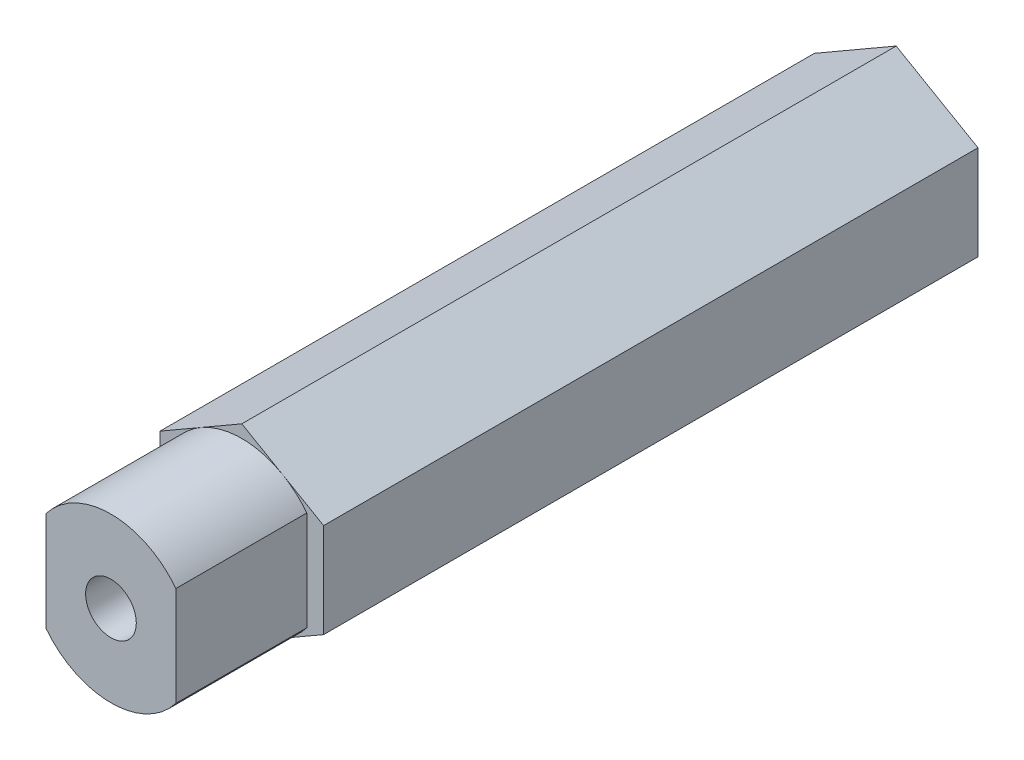
ISO-10303-21;
HEADER;
FILE_DESCRIPTION(('STEP AP214'),'2;1');
FILE_NAME('part.step','',(''),(''),'','','');
FILE_SCHEMA(('AUTOMOTIVE_DESIGN { 1 0 10303 214 1 1 1 1 }'));
ENDSEC;
DATA;
#1=APPLICATION_CONTEXT('core data for automotive mechanical design processes');
#2=APPLICATION_PROTOCOL_DEFINITION('international standard','automotive_design',2000,#1);
#3=PRODUCT_CONTEXT('',#1,'mechanical');
#4=PRODUCT('Part','Part','',(#3));
#5=PRODUCT_RELATED_PRODUCT_CATEGORY('part','',(#4));
#6=PRODUCT_DEFINITION_FORMATION('','',#4);
#7=PRODUCT_DEFINITION_CONTEXT('part definition',#1,'design');
#8=PRODUCT_DEFINITION('design','',#6,#7);
#9=PRODUCT_DEFINITION_SHAPE('','',#8);
#10=(LENGTH_UNIT() NAMED_UNIT(*) SI_UNIT(.MILLI.,.METRE.));
#11=(NAMED_UNIT(*) PLANE_ANGLE_UNIT() SI_UNIT($,.RADIAN.));
#12=(NAMED_UNIT(*) SI_UNIT($,.STERADIAN.) SOLID_ANGLE_UNIT());
#13=UNCERTAINTY_MEASURE_WITH_UNIT(LENGTH_MEASURE(1.E-05),#10,'distance_accuracy_value','');
#14=(GEOMETRIC_REPRESENTATION_CONTEXT(3) GLOBAL_UNCERTAINTY_ASSIGNED_CONTEXT((#13)) GLOBAL_UNIT_ASSIGNED_CONTEXT((#10,
#11,#12)) REPRESENTATION_CONTEXT('',''));
#15=CARTESIAN_POINT('',(0.,0.,0.));
#16=DIRECTION('',(0.,0.,1.));
#17=DIRECTION('',(1.,0.,0.));
#18=AXIS2_PLACEMENT_3D('',#15,#16,#17);
#19=CARTESIAN_POINT('',(0.,0.,24.));
#20=DIRECTION('',(0.,0.,-1.));
#21=DIRECTION('',(-1.,0.,0.));
#22=AXIS2_PLACEMENT_3D('',#19,#20,#21);
#23=PLANE('',#22);
#24=CARTESIAN_POINT('',(0.,0.,24.));
#25=DIRECTION('',(0.,0.,1.));
#26=DIRECTION('',(1.,0.,0.));
#27=AXIS2_PLACEMENT_3D('',#24,#25,#26);
#28=CIRCLE('',#27,1.55);
#29=CARTESIAN_POINT('',(1.55,0.,24.));
#30=VERTEX_POINT('',#29);
#31=EDGE_CURVE('E240',#30,#30,#28,.T.);
#32=ORIENTED_EDGE('',*,*,#31,.F.);
#33=EDGE_LOOP('',(#32));
#34=FACE_BOUND('',#33,.T.);
#35=CARTESIAN_POINT('',(0.,0.,24.));
#36=DIRECTION('',(0.,0.,1.));
#37=DIRECTION('',(1.,0.,0.));
#38=AXIS2_PLACEMENT_3D('',#35,#36,#37);
#39=CIRCLE('',#38,5.);
#40=CARTESIAN_POINT('',(-3.97,-3.03958878797774,24.));
#41=VERTEX_POINT('',#40);
#42=CARTESIAN_POINT('',(3.97,-3.03958878797774,24.));
#43=VERTEX_POINT('',#42);
#44=EDGE_CURVE('E54',#41,#43,#39,.T.);
#45=ORIENTED_EDGE('',*,*,#44,.T.);
#46=DIRECTION('',(0.,1.,0.));
#47=VECTOR('',#46,1.);
#48=CARTESIAN_POINT('',(3.97,0.,24.));
#49=LINE('',#48,#47);
#50=CARTESIAN_POINT('',(3.97,3.03958878797774,24.));
#51=VERTEX_POINT('',#50);
#52=EDGE_CURVE('E180',#43,#51,#49,.T.);
#53=ORIENTED_EDGE('',*,*,#52,.T.);
#54=CARTESIAN_POINT('',(0.,0.,24.));
#55=DIRECTION('',(0.,0.,1.));
#56=DIRECTION('',(1.,0.,0.));
#57=AXIS2_PLACEMENT_3D('',#54,#55,#56);
#58=CIRCLE('',#57,5.);
#59=CARTESIAN_POINT('',(-3.97,3.03958878797774,24.));
#60=VERTEX_POINT('',#59);
#61=EDGE_CURVE('E157',#60,#51,#58,.F.);
#62=ORIENTED_EDGE('',*,*,#61,.F.);
#63=DIRECTION('',(0.,1.,0.));
#64=VECTOR('',#63,1.);
#65=CARTESIAN_POINT('',(-3.97,0.,24.));
#66=LINE('',#65,#64);
#67=EDGE_CURVE('E170',#41,#60,#66,.T.);
#68=ORIENTED_EDGE('',*,*,#67,.F.);
#69=EDGE_LOOP('',(#45,#53,#62,#68));
#70=FACE_BOUND('',#69,.T.);
#71=ADVANCED_FACE('F39',(#34,#70),#23,.F.);
#72=CARTESIAN_POINT('',(0.,-5.77350269189626,24.));
#73=DIRECTION('',(0.5,0.866025403784439,0.));
#74=DIRECTION('',(-0.866025403784439,0.5,0.));
#75=AXIS2_PLACEMENT_3D('',#72,#73,#74);
#76=PLANE('',#75);
#77=DIRECTION('',(0.866025403784439,-0.5,0.));
#78=VECTOR('',#77,1.);
#79=CARTESIAN_POINT('',(-2.5,-4.33012701892219,16.));
#80=LINE('',#79,#78);
#81=CARTESIAN_POINT('',(-2.5,-4.33012701892219,16.));
#82=VERTEX_POINT('',#81);
#83=CARTESIAN_POINT('',(0.,-5.77350269189626,16.));
#84=VERTEX_POINT('',#83);
#85=EDGE_CURVE('E131',#82,#84,#80,.T.);
#86=ORIENTED_EDGE('',*,*,#85,.F.);
#87=DIRECTION('',(0.866025403784439,-0.5,0.));
#88=VECTOR('',#87,1.);
#89=CARTESIAN_POINT('',(-2.5,-4.33012701892219,16.));
#90=LINE('',#89,#88);
#91=CARTESIAN_POINT('',(-5.,-2.88675134594813,16.));
#92=VERTEX_POINT('',#91);
#93=EDGE_CURVE('E144',#92,#82,#90,.T.);
#94=ORIENTED_EDGE('',*,*,#93,.F.);
#95=DIRECTION('',(0.,0.,-1.));
#96=VECTOR('',#95,1.);
#97=CARTESIAN_POINT('',(-5.,-2.88675134594813,24.));
#98=LINE('',#97,#96);
#99=CARTESIAN_POINT('',(-5.,-2.88675134594813,-24.));
#100=VERTEX_POINT('',#99);
#101=EDGE_CURVE('E47',#92,#100,#98,.T.);
#102=ORIENTED_EDGE('',*,*,#101,.T.);
#103=DIRECTION('',(0.866025403784439,-0.5,0.));
#104=VECTOR('',#103,1.);
#105=CARTESIAN_POINT('',(0.,-5.77350269189626,-24.));
#106=LINE('',#105,#104);
#107=CARTESIAN_POINT('',(0.,-5.77350269189626,-24.));
#108=VERTEX_POINT('',#107);
#109=EDGE_CURVE('E203',#100,#108,#106,.T.);
#110=ORIENTED_EDGE('',*,*,#109,.T.);
#111=DIRECTION('',(0.,0.,-1.));
#112=VECTOR('',#111,1.);
#113=CARTESIAN_POINT('',(0.,-5.77350269189626,24.));
#114=LINE('',#113,#112);
#115=EDGE_CURVE('E147',#84,#108,#114,.T.);
#116=ORIENTED_EDGE('',*,*,#115,.F.);
#117=EDGE_LOOP('',(#86,#94,#102,#110,#116));
#118=FACE_BOUND('',#117,.T.);
#119=ADVANCED_FACE('F142',(#118),#76,.F.);
#120=CARTESIAN_POINT('',(5.,-2.88675134594813,24.));
#121=DIRECTION('',(-0.5,0.866025403784439,0.));
#122=DIRECTION('',(-0.866025403784439,-0.5,0.));
#123=AXIS2_PLACEMENT_3D('',#120,#121,#122);
#124=PLANE('',#123);
#125=DIRECTION('',(0.866025403784439,0.5,0.));
#126=VECTOR('',#125,1.);
#127=CARTESIAN_POINT('',(2.5,-4.33012701892219,16.));
#128=LINE('',#127,#126);
#129=CARTESIAN_POINT('',(2.5,-4.3301270189222,16.));
#130=VERTEX_POINT('',#129);
#131=EDGE_CURVE('E133',#84,#130,#128,.T.);
#132=ORIENTED_EDGE('',*,*,#131,.F.);
#133=ORIENTED_EDGE('',*,*,#115,.T.);
#134=DIRECTION('',(0.866025403784439,0.5,0.));
#135=VECTOR('',#134,1.);
#136=CARTESIAN_POINT('',(5.,-2.88675134594813,-24.));
#137=LINE('',#136,#135);
#138=CARTESIAN_POINT('',(5.,-2.88675134594813,-24.));
#139=VERTEX_POINT('',#138);
#140=EDGE_CURVE('E205',#108,#139,#137,.T.);
#141=ORIENTED_EDGE('',*,*,#140,.T.);
#142=DIRECTION('',(0.,0.,-1.));
#143=VECTOR('',#142,1.);
#144=CARTESIAN_POINT('',(5.,-2.88675134594813,24.));
#145=LINE('',#144,#143);
#146=CARTESIAN_POINT('',(5.,-2.88675134594813,16.));
#147=VERTEX_POINT('',#146);
#148=EDGE_CURVE('E216',#147,#139,#145,.T.);
#149=ORIENTED_EDGE('',*,*,#148,.F.);
#150=DIRECTION('',(0.866025403784439,0.5,0.));
#151=VECTOR('',#150,1.);
#152=CARTESIAN_POINT('',(2.5,-4.33012701892219,16.));
#153=LINE('',#152,#151);
#154=EDGE_CURVE('E179',#130,#147,#153,.T.);
#155=ORIENTED_EDGE('',*,*,#154,.F.);
#156=EDGE_LOOP('',(#132,#133,#141,#149,#155));
#157=FACE_BOUND('',#156,.T.);
#158=ADVANCED_FACE('F231',(#157),#124,.F.);
#159=CARTESIAN_POINT('',(-5.,2.88675134594813,24.));
#160=DIRECTION('',(0.5,-0.866025403784438,0.));
#161=DIRECTION('',(0.866025403784439,0.5,0.));
#162=AXIS2_PLACEMENT_3D('',#159,#160,#161);
#163=PLANE('',#162);
#164=DIRECTION('',(-0.866025403784439,-0.5,0.));
#165=VECTOR('',#164,1.);
#166=CARTESIAN_POINT('',(-2.5,4.33012701892219,16.));
#167=LINE('',#166,#165);
#168=CARTESIAN_POINT('',(0.,5.77350269189626,16.));
#169=VERTEX_POINT('',#168);
#170=CARTESIAN_POINT('',(-2.5,4.33012701892219,16.));
#171=VERTEX_POINT('',#170);
#172=EDGE_CURVE('E233',#169,#171,#167,.T.);
#173=ORIENTED_EDGE('',*,*,#172,.F.);
#174=DIRECTION('',(0.,0.,-1.));
#175=VECTOR('',#174,1.);
#176=CARTESIAN_POINT('',(0.,5.77350269189626,24.));
#177=LINE('',#176,#175);
#178=CARTESIAN_POINT('',(0.,5.77350269189626,-24.));
#179=VERTEX_POINT('',#178);
#180=EDGE_CURVE('E62',#169,#179,#177,.T.);
#181=ORIENTED_EDGE('',*,*,#180,.T.);
#182=DIRECTION('',(-0.866025403784439,-0.5,0.));
#183=VECTOR('',#182,1.);
#184=CARTESIAN_POINT('',(-5.,2.88675134594813,-24.));
#185=LINE('',#184,#183);
#186=CARTESIAN_POINT('',(-5.,2.88675134594813,-24.));
#187=VERTEX_POINT('',#186);
#188=EDGE_CURVE('E175',#179,#187,#185,.T.);
#189=ORIENTED_EDGE('',*,*,#188,.T.);
#190=DIRECTION('',(0.,0.,-1.));
#191=VECTOR('',#190,1.);
#192=CARTESIAN_POINT('',(-5.,2.88675134594813,24.));
#193=LINE('',#192,#191);
#194=CARTESIAN_POINT('',(-5.,2.88675134594813,16.));
#195=VERTEX_POINT('',#194);
#196=EDGE_CURVE('E11',#195,#187,#193,.T.);
#197=ORIENTED_EDGE('',*,*,#196,.F.);
#198=DIRECTION('',(-0.866025403784439,-0.5,0.));
#199=VECTOR('',#198,1.);
#200=CARTESIAN_POINT('',(-2.5,4.33012701892219,16.));
#201=LINE('',#200,#199);
#202=EDGE_CURVE('E165',#171,#195,#201,.T.);
#203=ORIENTED_EDGE('',*,*,#202,.F.);
#204=EDGE_LOOP('',(#173,#181,#189,#197,#203));
#205=FACE_BOUND('',#204,.T.);
#206=ADVANCED_FACE('F41',(#205),#163,.F.);
#207=CARTESIAN_POINT('',(0.,5.77350269189626,24.));
#208=DIRECTION('',(-0.5,-0.866025403784439,0.));
#209=DIRECTION('',(0.866025403784439,-0.5,0.));
#210=AXIS2_PLACEMENT_3D('',#207,#208,#209);
#211=PLANE('',#210);
#212=DIRECTION('',(-0.866025403784439,0.5,0.));
#213=VECTOR('',#212,1.);
#214=CARTESIAN_POINT('',(2.5,4.33012701892219,16.));
#215=LINE('',#214,#213);
#216=CARTESIAN_POINT('',(2.5,4.3301270189222,16.));
#217=VERTEX_POINT('',#216);
#218=EDGE_CURVE('E195',#217,#169,#215,.T.);
#219=ORIENTED_EDGE('',*,*,#218,.F.);
#220=DIRECTION('',(-0.866025403784439,0.5,0.));
#221=VECTOR('',#220,1.);
#222=CARTESIAN_POINT('',(2.5,4.33012701892219,16.));
#223=LINE('',#222,#221);
#224=CARTESIAN_POINT('',(5.,2.88675134594813,16.));
#225=VERTEX_POINT('',#224);
#226=EDGE_CURVE('E184',#225,#217,#223,.T.);
#227=ORIENTED_EDGE('',*,*,#226,.F.);
#228=DIRECTION('',(0.,0.,-1.));
#229=VECTOR('',#228,1.);
#230=CARTESIAN_POINT('',(5.,2.88675134594813,24.));
#231=LINE('',#230,#229);
#232=CARTESIAN_POINT('',(5.,2.88675134594813,-24.));
#233=VERTEX_POINT('',#232);
#234=EDGE_CURVE('E214',#225,#233,#231,.T.);
#235=ORIENTED_EDGE('',*,*,#234,.T.);
#236=DIRECTION('',(-0.866025403784439,0.5,0.));
#237=VECTOR('',#236,1.);
#238=CARTESIAN_POINT('',(0.,5.77350269189626,-24.));
#239=LINE('',#238,#237);
#240=EDGE_CURVE('E211',#233,#179,#239,.T.);
#241=ORIENTED_EDGE('',*,*,#240,.T.);
#242=ORIENTED_EDGE('',*,*,#180,.F.);
#243=EDGE_LOOP('',(#219,#227,#235,#241,#242));
#244=FACE_BOUND('',#243,.T.);
#245=ADVANCED_FACE('F252',(#244),#211,.F.);
#246=CARTESIAN_POINT('',(-5.,-2.88675134594813,24.));
#247=DIRECTION('',(1.,0.,0.));
#248=DIRECTION('',(0.,0.,-1.));
#249=AXIS2_PLACEMENT_3D('',#246,#247,#248);
#250=PLANE('',#249);
#251=DIRECTION('',(0.,-1.,0.));
#252=VECTOR('',#251,1.);
#253=CARTESIAN_POINT('',(-5.,0.,16.));
#254=LINE('',#253,#252);
#255=EDGE_CURVE('E161',#195,#92,#254,.T.);
#256=ORIENTED_EDGE('',*,*,#255,.F.);
#257=ORIENTED_EDGE('',*,*,#196,.T.);
#258=DIRECTION('',(0.,-1.,0.));
#259=VECTOR('',#258,1.);
#260=CARTESIAN_POINT('',(-5.,-2.88675134594813,-24.));
#261=LINE('',#260,#259);
#262=EDGE_CURVE('E200',#187,#100,#261,.T.);
#263=ORIENTED_EDGE('',*,*,#262,.T.);
#264=ORIENTED_EDGE('',*,*,#101,.F.);
#265=EDGE_LOOP('',(#256,#257,#263,#264));
#266=FACE_BOUND('',#265,.T.);
#267=ADVANCED_FACE('F222',(#266),#250,.F.);
#268=CARTESIAN_POINT('',(5.,2.88675134594813,24.));
#269=DIRECTION('',(-1.,0.,0.));
#270=DIRECTION('',(0.,-1.,0.));
#271=AXIS2_PLACEMENT_3D('',#268,#269,#270);
#272=PLANE('',#271);
#273=DIRECTION('',(0.,1.,0.));
#274=VECTOR('',#273,1.);
#275=CARTESIAN_POINT('',(5.,0.,16.));
#276=LINE('',#275,#274);
#277=EDGE_CURVE('E182',#147,#225,#276,.T.);
#278=ORIENTED_EDGE('',*,*,#277,.F.);
#279=ORIENTED_EDGE('',*,*,#148,.T.);
#280=DIRECTION('',(0.,1.,0.));
#281=VECTOR('',#280,1.);
#282=CARTESIAN_POINT('',(5.,2.88675134594813,-24.));
#283=LINE('',#282,#281);
#284=EDGE_CURVE('E208',#139,#233,#283,.T.);
#285=ORIENTED_EDGE('',*,*,#284,.T.);
#286=ORIENTED_EDGE('',*,*,#234,.F.);
#287=EDGE_LOOP('',(#278,#279,#285,#286));
#288=FACE_BOUND('',#287,.T.);
#289=ADVANCED_FACE('F257',(#288),#272,.F.);
#290=CARTESIAN_POINT('',(0.,0.,-24.));
#291=DIRECTION('',(0.,0.,-1.));
#292=DIRECTION('',(-1.,0.,0.));
#293=AXIS2_PLACEMENT_3D('',#290,#291,#292);
#294=PLANE('',#293);
#295=ORIENTED_EDGE('',*,*,#188,.F.);
#296=ORIENTED_EDGE('',*,*,#240,.F.);
#297=ORIENTED_EDGE('',*,*,#284,.F.);
#298=ORIENTED_EDGE('',*,*,#140,.F.);
#299=ORIENTED_EDGE('',*,*,#109,.F.);
#300=ORIENTED_EDGE('',*,*,#262,.F.);
#301=EDGE_LOOP('',(#295,#296,#297,#298,#299,#300));
#302=FACE_BOUND('',#301,.T.);
#303=ADVANCED_FACE('F226',(#302),#294,.T.);
#304=CARTESIAN_POINT('',(3.97,0.,16.));
#305=DIRECTION('',(1.,0.,0.));
#306=DIRECTION('',(0.,1.,0.));
#307=AXIS2_PLACEMENT_3D('',#304,#305,#306);
#308=PLANE('',#307);
#309=ORIENTED_EDGE('',*,*,#52,.F.);
#310=DIRECTION('',(0.,0.,1.));
#311=VECTOR('',#310,1.);
#312=CARTESIAN_POINT('',(3.97,-3.03958878797774,16.));
#313=LINE('',#312,#311);
#314=CARTESIAN_POINT('',(3.97,-3.03958878797774,16.));
#315=VERTEX_POINT('',#314);
#316=EDGE_CURVE('E171',#315,#43,#313,.T.);
#317=ORIENTED_EDGE('',*,*,#316,.F.);
#318=DIRECTION('',(0.,1.,0.));
#319=VECTOR('',#318,1.);
#320=CARTESIAN_POINT('',(3.97,0.,16.));
#321=LINE('',#320,#319);
#322=CARTESIAN_POINT('',(3.97,3.03958878797774,16.));
#323=VERTEX_POINT('',#322);
#324=EDGE_CURVE('E190',#315,#323,#321,.T.);
#325=ORIENTED_EDGE('',*,*,#324,.T.);
#326=DIRECTION('',(0.,0.,1.));
#327=VECTOR('',#326,1.);
#328=CARTESIAN_POINT('',(3.97,3.03958878797774,16.));
#329=LINE('',#328,#327);
#330=EDGE_CURVE('E192',#323,#51,#329,.T.);
#331=ORIENTED_EDGE('',*,*,#330,.T.);
#332=EDGE_LOOP('',(#309,#317,#325,#331));
#333=FACE_BOUND('',#332,.T.);
#334=ADVANCED_FACE('F263',(#333),#308,.T.);
#335=CARTESIAN_POINT('',(0.,0.,16.));
#336=DIRECTION('',(0.,0.,1.));
#337=DIRECTION('',(1.,0.,0.));
#338=AXIS2_PLACEMENT_3D('',#335,#336,#337);
#339=PLANE('',#338);
#340=CARTESIAN_POINT('',(0.,0.,16.));
#341=DIRECTION('',(0.,0.,1.));
#342=DIRECTION('',(1.,0.,0.));
#343=AXIS2_PLACEMENT_3D('',#340,#341,#342);
#344=CIRCLE('',#343,5.);
#345=EDGE_CURVE('E177',#130,#315,#344,.T.);
#346=ORIENTED_EDGE('',*,*,#345,.F.);
#347=ORIENTED_EDGE('',*,*,#154,.T.);
#348=ORIENTED_EDGE('',*,*,#277,.T.);
#349=ORIENTED_EDGE('',*,*,#226,.T.);
#350=CARTESIAN_POINT('',(0.,0.,16.));
#351=DIRECTION('',(0.,0.,1.));
#352=DIRECTION('',(1.,0.,0.));
#353=AXIS2_PLACEMENT_3D('',#350,#351,#352);
#354=CIRCLE('',#353,5.);
#355=EDGE_CURVE('E187',#217,#323,#354,.F.);
#356=ORIENTED_EDGE('',*,*,#355,.T.);
#357=ORIENTED_EDGE('',*,*,#324,.F.);
#358=EDGE_LOOP('',(#346,#347,#348,#349,#356,#357));
#359=FACE_BOUND('',#358,.T.);
#360=ADVANCED_FACE('F259',(#359),#339,.T.);
#361=CARTESIAN_POINT('',(0.,0.,16.));
#362=DIRECTION('',(0.,0.,1.));
#363=DIRECTION('',(1.,0.,0.));
#364=AXIS2_PLACEMENT_3D('',#361,#362,#363);
#365=CYLINDRICAL_SURFACE('',#364,5.);
#366=ORIENTED_EDGE('',*,*,#44,.F.);
#367=DIRECTION('',(0.,0.,1.));
#368=VECTOR('',#367,1.);
#369=CARTESIAN_POINT('',(-3.97,-3.03958878797774,16.));
#370=LINE('',#369,#368);
#371=CARTESIAN_POINT('',(-3.97,-3.03958878797774,16.));
#372=VERTEX_POINT('',#371);
#373=EDGE_CURVE('E152',#372,#41,#370,.T.);
#374=ORIENTED_EDGE('',*,*,#373,.F.);
#375=CARTESIAN_POINT('',(0.,0.,16.));
#376=DIRECTION('',(0.,0.,1.));
#377=DIRECTION('',(1.,0.,0.));
#378=AXIS2_PLACEMENT_3D('',#375,#376,#377);
#379=CIRCLE('',#378,5.);
#380=EDGE_CURVE('E150',#372,#82,#379,.T.);
#381=ORIENTED_EDGE('',*,*,#380,.T.);
#382=CARTESIAN_POINT('',(0.,0.,16.));
#383=DIRECTION('',(0.,0.,1.));
#384=DIRECTION('',(1.,0.,0.));
#385=AXIS2_PLACEMENT_3D('',#382,#383,#384);
#386=CIRCLE('',#385,5.);
#387=EDGE_CURVE('E128',#82,#130,#386,.T.);
#388=ORIENTED_EDGE('',*,*,#387,.T.);
#389=ORIENTED_EDGE('',*,*,#345,.T.);
#390=ORIENTED_EDGE('',*,*,#316,.T.);
#391=EDGE_LOOP('',(#366,#374,#381,#388,#389,#390));
#392=FACE_BOUND('',#391,.T.);
#393=ADVANCED_FACE('F151',(#392),#365,.T.);
#394=CARTESIAN_POINT('',(0.,0.,16.));
#395=DIRECTION('',(0.,0.,1.));
#396=DIRECTION('',(1.,0.,0.));
#397=AXIS2_PLACEMENT_3D('',#394,#395,#396);
#398=CYLINDRICAL_SURFACE('',#397,5.);
#399=ORIENTED_EDGE('',*,*,#61,.T.);
#400=ORIENTED_EDGE('',*,*,#330,.F.);
#401=ORIENTED_EDGE('',*,*,#355,.F.);
#402=CARTESIAN_POINT('',(0.,0.,16.));
#403=DIRECTION('',(0.,0.,1.));
#404=DIRECTION('',(1.,0.,0.));
#405=AXIS2_PLACEMENT_3D('',#402,#403,#404);
#406=CIRCLE('',#405,5.);
#407=EDGE_CURVE('E235',#171,#217,#406,.F.);
#408=ORIENTED_EDGE('',*,*,#407,.F.);
#409=CARTESIAN_POINT('',(0.,0.,16.));
#410=DIRECTION('',(0.,0.,1.));
#411=DIRECTION('',(1.,0.,0.));
#412=AXIS2_PLACEMENT_3D('',#409,#410,#411);
#413=CIRCLE('',#412,5.);
#414=CARTESIAN_POINT('',(-3.97,3.03958878797774,16.));
#415=VERTEX_POINT('',#414);
#416=EDGE_CURVE('E246',#415,#171,#413,.F.);
#417=ORIENTED_EDGE('',*,*,#416,.F.);
#418=DIRECTION('',(0.,0.,1.));
#419=VECTOR('',#418,1.);
#420=CARTESIAN_POINT('',(-3.97,3.03958878797774,16.));
#421=LINE('',#420,#419);
#422=EDGE_CURVE('E163',#415,#60,#421,.T.);
#423=ORIENTED_EDGE('',*,*,#422,.T.);
#424=EDGE_LOOP('',(#399,#400,#401,#408,#417,#423));
#425=FACE_BOUND('',#424,.T.);
#426=ADVANCED_FACE('F272',(#425),#398,.T.);
#427=CARTESIAN_POINT('',(-3.97,0.,16.));
#428=DIRECTION('',(1.,0.,0.));
#429=DIRECTION('',(0.,0.,-1.));
#430=AXIS2_PLACEMENT_3D('',#427,#428,#429);
#431=PLANE('',#430);
#432=ORIENTED_EDGE('',*,*,#67,.T.);
#433=ORIENTED_EDGE('',*,*,#422,.F.);
#434=DIRECTION('',(0.,1.,0.));
#435=VECTOR('',#434,1.);
#436=CARTESIAN_POINT('',(-3.97,0.,16.));
#437=LINE('',#436,#435);
#438=EDGE_CURVE('E156',#372,#415,#437,.T.);
#439=ORIENTED_EDGE('',*,*,#438,.F.);
#440=ORIENTED_EDGE('',*,*,#373,.T.);
#441=EDGE_LOOP('',(#432,#433,#439,#440));
#442=FACE_BOUND('',#441,.T.);
#443=ADVANCED_FACE('F269',(#442),#431,.F.);
#444=CARTESIAN_POINT('',(0.,0.,16.));
#445=DIRECTION('',(0.,0.,1.));
#446=DIRECTION('',(1.,0.,0.));
#447=AXIS2_PLACEMENT_3D('',#444,#445,#446);
#448=PLANE('',#447);
#449=ORIENTED_EDGE('',*,*,#380,.F.);
#450=ORIENTED_EDGE('',*,*,#438,.T.);
#451=ORIENTED_EDGE('',*,*,#416,.T.);
#452=ORIENTED_EDGE('',*,*,#202,.T.);
#453=ORIENTED_EDGE('',*,*,#255,.T.);
#454=ORIENTED_EDGE('',*,*,#93,.T.);
#455=EDGE_LOOP('',(#449,#450,#451,#452,#453,#454));
#456=FACE_BOUND('',#455,.T.);
#457=ADVANCED_FACE('F159',(#456),#448,.T.);
#458=CARTESIAN_POINT('',(0.,0.,16.));
#459=DIRECTION('',(0.,0.,1.));
#460=DIRECTION('',(1.,0.,0.));
#461=AXIS2_PLACEMENT_3D('',#458,#459,#460);
#462=PLANE('',#461);
#463=ORIENTED_EDGE('',*,*,#172,.T.);
#464=ORIENTED_EDGE('',*,*,#407,.T.);
#465=ORIENTED_EDGE('',*,*,#218,.T.);
#466=EDGE_LOOP('',(#463,#464,#465));
#467=FACE_BOUND('',#466,.T.);
#468=ADVANCED_FACE('F275',(#467),#462,.T.);
#469=CARTESIAN_POINT('',(0.,0.,16.));
#470=DIRECTION('',(0.,0.,1.));
#471=DIRECTION('',(1.,0.,0.));
#472=AXIS2_PLACEMENT_3D('',#469,#470,#471);
#473=PLANE('',#472);
#474=ORIENTED_EDGE('',*,*,#387,.F.);
#475=ORIENTED_EDGE('',*,*,#85,.T.);
#476=ORIENTED_EDGE('',*,*,#131,.T.);
#477=EDGE_LOOP('',(#474,#475,#476));
#478=FACE_BOUND('',#477,.T.);
#479=ADVANCED_FACE('F130',(#478),#473,.T.);
#480=CARTESIAN_POINT('',(0.,0.,16.));
#481=DIRECTION('',(0.,0.,1.));
#482=DIRECTION('',(1.,0.,0.));
#483=AXIS2_PLACEMENT_3D('',#480,#481,#482);
#484=CYLINDRICAL_SURFACE('',#483,1.55);
#485=CARTESIAN_POINT('',(0.,0.,16.));
#486=DIRECTION('',(0.,0.,1.));
#487=DIRECTION('',(1.,0.,0.));
#488=AXIS2_PLACEMENT_3D('',#485,#486,#487);
#489=CIRCLE('',#488,1.55);
#490=CARTESIAN_POINT('',(1.55,0.,16.));
#491=VERTEX_POINT('',#490);
#492=EDGE_CURVE('E137',#491,#491,#489,.T.);
#493=ORIENTED_EDGE('',*,*,#492,.F.);
#494=EDGE_LOOP('',(#493));
#495=FACE_BOUND('',#494,.T.);
#496=ORIENTED_EDGE('',*,*,#31,.T.);
#497=EDGE_LOOP('',(#496));
#498=FACE_BOUND('',#497,.T.);
#499=ADVANCED_FACE('F282',(#495,#498),#484,.F.);
#500=CARTESIAN_POINT('',(0.,0.,16.));
#501=DIRECTION('',(0.,0.,1.));
#502=DIRECTION('',(1.,0.,0.));
#503=AXIS2_PLACEMENT_3D('',#500,#501,#502);
#504=PLANE('',#503);
#505=ORIENTED_EDGE('',*,*,#492,.T.);
#506=EDGE_LOOP('',(#505));
#507=FACE_BOUND('',#506,.T.);
#508=ADVANCED_FACE('F374',(#507),#504,.T.);
#509=CLOSED_SHELL('',(#71,#119,#158,#206,#245,#267,#289,#303,#334,#360,#393,#426,#443,#457,#468,
#479,#499,#508));
#510=MANIFOLD_SOLID_BREP('B2',#509);
#511=ADVANCED_BREP_SHAPE_REPRESENTATION('',(#18,#510),#14);
#512=SHAPE_DEFINITION_REPRESENTATION(#9,#511);
ENDSEC;
END-ISO-10303-21;
